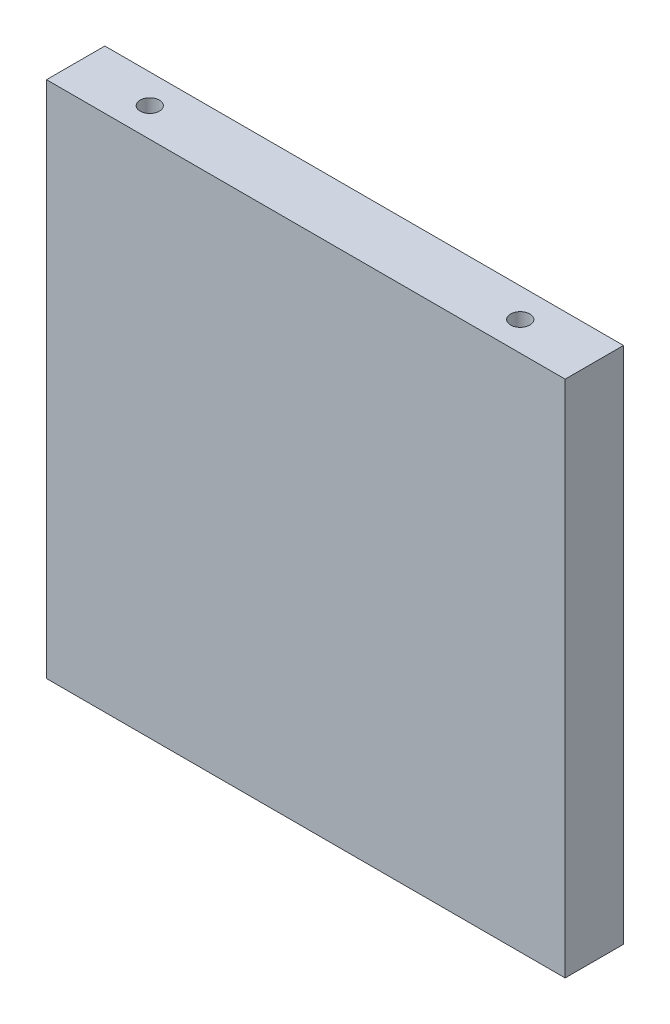
ISO-10303-21;
HEADER;
FILE_DESCRIPTION(('STEP AP214'),'2;1');
FILE_NAME('part.step','',(''),(''),'','','');
FILE_SCHEMA(('AUTOMOTIVE_DESIGN { 1 0 10303 214 1 1 1 1 }'));
ENDSEC;
DATA;
#1=APPLICATION_CONTEXT('core data for automotive mechanical design processes');
#2=APPLICATION_PROTOCOL_DEFINITION('international standard','automotive_design',2000,#1);
#3=PRODUCT_CONTEXT('',#1,'mechanical');
#4=PRODUCT('Part','Part','',(#3));
#5=PRODUCT_RELATED_PRODUCT_CATEGORY('part','',(#4));
#6=PRODUCT_DEFINITION_FORMATION('','',#4);
#7=PRODUCT_DEFINITION_CONTEXT('part definition',#1,'design');
#8=PRODUCT_DEFINITION('design','',#6,#7);
#9=PRODUCT_DEFINITION_SHAPE('','',#8);
#10=(LENGTH_UNIT() NAMED_UNIT(*) SI_UNIT(.MILLI.,.METRE.));
#11=(NAMED_UNIT(*) PLANE_ANGLE_UNIT() SI_UNIT($,.RADIAN.));
#12=(NAMED_UNIT(*) SI_UNIT($,.STERADIAN.) SOLID_ANGLE_UNIT());
#13=UNCERTAINTY_MEASURE_WITH_UNIT(LENGTH_MEASURE(1.E-05),#10,'distance_accuracy_value','');
#14=(GEOMETRIC_REPRESENTATION_CONTEXT(3) GLOBAL_UNCERTAINTY_ASSIGNED_CONTEXT((#13)) GLOBAL_UNIT_ASSIGNED_CONTEXT((#10,
#11,#12)) REPRESENTATION_CONTEXT('',''));
#15=CARTESIAN_POINT('',(0.,0.,0.));
#16=DIRECTION('',(0.,0.,1.));
#17=DIRECTION('',(1.,0.,0.));
#18=AXIS2_PLACEMENT_3D('',#15,#16,#17);
#19=CARTESIAN_POINT('',(0.,88.9,0.));
#20=DIRECTION('',(0.,0.,-1.));
#21=DIRECTION('',(-1.,0.,0.));
#22=AXIS2_PLACEMENT_3D('',#19,#20,#21);
#23=PLANE('',#22);
#24=DIRECTION('',(1.,0.,0.));
#25=VECTOR('',#24,1.);
#26=CARTESIAN_POINT('',(0.,0.,0.));
#27=LINE('',#26,#25);
#28=CARTESIAN_POINT('',(0.,0.,0.));
#29=VERTEX_POINT('',#28);
#30=CARTESIAN_POINT('',(88.9,0.,0.));
#31=VERTEX_POINT('',#30);
#32=EDGE_CURVE('E105',#29,#31,#27,.T.);
#33=ORIENTED_EDGE('',*,*,#32,.T.);
#34=DIRECTION('',(0.,-1.,0.));
#35=VECTOR('',#34,1.);
#36=CARTESIAN_POINT('',(88.9,88.9,0.));
#37=LINE('',#36,#35);
#38=CARTESIAN_POINT('',(88.9,88.9,0.));
#39=VERTEX_POINT('',#38);
#40=EDGE_CURVE('E11',#39,#31,#37,.T.);
#41=ORIENTED_EDGE('',*,*,#40,.F.);
#42=DIRECTION('',(1.,0.,0.));
#43=VECTOR('',#42,1.);
#44=CARTESIAN_POINT('',(0.,88.9,0.));
#45=LINE('',#44,#43);
#46=CARTESIAN_POINT('',(0.,88.9,0.));
#47=VERTEX_POINT('',#46);
#48=EDGE_CURVE('E85',#47,#39,#45,.T.);
#49=ORIENTED_EDGE('',*,*,#48,.F.);
#50=DIRECTION('',(0.,-1.,0.));
#51=VECTOR('',#50,1.);
#52=CARTESIAN_POINT('',(0.,88.9,0.));
#53=LINE('',#52,#51);
#54=EDGE_CURVE('E51',#47,#29,#53,.T.);
#55=ORIENTED_EDGE('',*,*,#54,.T.);
#56=EDGE_LOOP('',(#33,#41,#49,#55));
#57=FACE_BOUND('',#56,.T.);
#58=ADVANCED_FACE('F35',(#57),#23,.F.);
#59=CARTESIAN_POINT('',(88.9,88.9,0.));
#60=DIRECTION('',(-1.,0.,0.));
#61=DIRECTION('',(0.,0.,1.));
#62=AXIS2_PLACEMENT_3D('',#59,#60,#61);
#63=PLANE('',#62);
#64=DIRECTION('',(0.,0.,-1.));
#65=VECTOR('',#64,1.);
#66=CARTESIAN_POINT('',(88.9,0.,0.));
#67=LINE('',#66,#65);
#68=CARTESIAN_POINT('',(88.9,0.,-10.));
#69=VERTEX_POINT('',#68);
#70=EDGE_CURVE('E90',#31,#69,#67,.T.);
#71=ORIENTED_EDGE('',*,*,#70,.T.);
#72=DIRECTION('',(0.,-1.,0.));
#73=VECTOR('',#72,1.);
#74=CARTESIAN_POINT('',(88.9,88.9,-10.));
#75=LINE('',#74,#73);
#76=CARTESIAN_POINT('',(88.9,88.9,-10.));
#77=VERTEX_POINT('',#76);
#78=EDGE_CURVE('E43',#77,#69,#75,.T.);
#79=ORIENTED_EDGE('',*,*,#78,.F.);
#80=DIRECTION('',(0.,0.,-1.));
#81=VECTOR('',#80,1.);
#82=CARTESIAN_POINT('',(88.9,88.9,0.));
#83=LINE('',#82,#81);
#84=EDGE_CURVE('E76',#39,#77,#83,.T.);
#85=ORIENTED_EDGE('',*,*,#84,.F.);
#86=ORIENTED_EDGE('',*,*,#40,.T.);
#87=EDGE_LOOP('',(#71,#79,#85,#86));
#88=FACE_BOUND('',#87,.T.);
#89=ADVANCED_FACE('F89',(#88),#63,.F.);
#90=CARTESIAN_POINT('',(0.,88.9,-10.));
#91=DIRECTION('',(0.,0.,-1.));
#92=DIRECTION('',(-1.,0.,0.));
#93=AXIS2_PLACEMENT_3D('',#90,#91,#92);
#94=PLANE('',#93);
#95=DIRECTION('',(1.,0.,0.));
#96=VECTOR('',#95,1.);
#97=CARTESIAN_POINT('',(0.,0.,-10.));
#98=LINE('',#97,#96);
#99=CARTESIAN_POINT('',(0.,0.,-10.));
#100=VERTEX_POINT('',#99);
#101=EDGE_CURVE('E108',#100,#69,#98,.T.);
#102=ORIENTED_EDGE('',*,*,#101,.F.);
#103=DIRECTION('',(0.,-1.,0.));
#104=VECTOR('',#103,1.);
#105=CARTESIAN_POINT('',(0.,88.9,-10.));
#106=LINE('',#105,#104);
#107=CARTESIAN_POINT('',(0.,88.9,-10.));
#108=VERTEX_POINT('',#107);
#109=EDGE_CURVE('E65',#108,#100,#106,.T.);
#110=ORIENTED_EDGE('',*,*,#109,.F.);
#111=DIRECTION('',(1.,0.,0.));
#112=VECTOR('',#111,1.);
#113=CARTESIAN_POINT('',(0.,88.9,-10.));
#114=LINE('',#113,#112);
#115=EDGE_CURVE('E84',#108,#77,#114,.T.);
#116=ORIENTED_EDGE('',*,*,#115,.T.);
#117=ORIENTED_EDGE('',*,*,#78,.T.);
#118=EDGE_LOOP('',(#102,#110,#116,#117));
#119=FACE_BOUND('',#118,.T.);
#120=ADVANCED_FACE('F93',(#119),#94,.T.);
#121=CARTESIAN_POINT('',(12.7,88.9,-5.));
#122=DIRECTION('',(0.,-1.,0.));
#123=DIRECTION('',(0.,0.,-1.));
#124=AXIS2_PLACEMENT_3D('',#121,#122,#123);
#125=CYLINDRICAL_SURFACE('',#124,1.65);
#126=CARTESIAN_POINT('',(12.7,88.9,-5.));
#127=DIRECTION('',(0.,1.,0.));
#128=DIRECTION('',(0.,0.,1.));
#129=AXIS2_PLACEMENT_3D('',#126,#127,#128);
#130=CIRCLE('',#129,1.65);
#131=CARTESIAN_POINT('',(12.7,88.9,-3.35));
#132=VERTEX_POINT('',#131);
#133=EDGE_CURVE('E96',#132,#132,#130,.T.);
#134=ORIENTED_EDGE('',*,*,#133,.T.);
#135=EDGE_LOOP('',(#134));
#136=FACE_BOUND('',#135,.T.);
#137=CARTESIAN_POINT('',(12.7,0.,-5.));
#138=DIRECTION('',(0.,1.,0.));
#139=DIRECTION('',(0.,0.,1.));
#140=AXIS2_PLACEMENT_3D('',#137,#138,#139);
#141=CIRCLE('',#140,1.65);
#142=CARTESIAN_POINT('',(12.7,0.,-3.35));
#143=VERTEX_POINT('',#142);
#144=EDGE_CURVE('E113',#143,#143,#141,.T.);
#145=ORIENTED_EDGE('',*,*,#144,.F.);
#146=EDGE_LOOP('',(#145));
#147=FACE_BOUND('',#146,.T.);
#148=ADVANCED_FACE('F134',(#136,#147),#125,.F.);
#149=CARTESIAN_POINT('',(0.,88.9,0.));
#150=DIRECTION('',(-1.,0.,0.));
#151=DIRECTION('',(0.,0.,1.));
#152=AXIS2_PLACEMENT_3D('',#149,#150,#151);
#153=PLANE('',#152);
#154=DIRECTION('',(0.,0.,-1.));
#155=VECTOR('',#154,1.);
#156=CARTESIAN_POINT('',(0.,0.,0.));
#157=LINE('',#156,#155);
#158=EDGE_CURVE('E110',#29,#100,#157,.T.);
#159=ORIENTED_EDGE('',*,*,#158,.F.);
#160=ORIENTED_EDGE('',*,*,#54,.F.);
#161=DIRECTION('',(0.,0.,-1.));
#162=VECTOR('',#161,1.);
#163=CARTESIAN_POINT('',(0.,88.9,0.));
#164=LINE('',#163,#162);
#165=EDGE_CURVE('E94',#47,#108,#164,.T.);
#166=ORIENTED_EDGE('',*,*,#165,.T.);
#167=ORIENTED_EDGE('',*,*,#109,.T.);
#168=EDGE_LOOP('',(#159,#160,#166,#167));
#169=FACE_BOUND('',#168,.T.);
#170=ADVANCED_FACE('F126',(#169),#153,.T.);
#171=CARTESIAN_POINT('',(76.2,88.9,-5.00000000000001));
#172=DIRECTION('',(0.,-1.,0.));
#173=DIRECTION('',(0.,0.,-1.));
#174=AXIS2_PLACEMENT_3D('',#171,#172,#173);
#175=CYLINDRICAL_SURFACE('',#174,1.65);
#176=CARTESIAN_POINT('',(76.2,88.9,-5.00000000000001));
#177=DIRECTION('',(0.,1.,0.));
#178=DIRECTION('',(0.,0.,1.));
#179=AXIS2_PLACEMENT_3D('',#176,#177,#178);
#180=CIRCLE('',#179,1.65);
#181=CARTESIAN_POINT('',(76.2,88.9,-3.35000000000001));
#182=VERTEX_POINT('',#181);
#183=EDGE_CURVE('E102',#182,#182,#180,.T.);
#184=ORIENTED_EDGE('',*,*,#183,.T.);
#185=EDGE_LOOP('',(#184));
#186=FACE_BOUND('',#185,.T.);
#187=CARTESIAN_POINT('',(76.2,0.,-5.00000000000001));
#188=DIRECTION('',(0.,1.,0.));
#189=DIRECTION('',(0.,0.,1.));
#190=AXIS2_PLACEMENT_3D('',#187,#188,#189);
#191=CIRCLE('',#190,1.65);
#192=CARTESIAN_POINT('',(76.2,0.,-3.35000000000001));
#193=VERTEX_POINT('',#192);
#194=EDGE_CURVE('E116',#193,#193,#191,.T.);
#195=ORIENTED_EDGE('',*,*,#194,.F.);
#196=EDGE_LOOP('',(#195));
#197=FACE_BOUND('',#196,.T.);
#198=ADVANCED_FACE('F124',(#186,#197),#175,.F.);
#199=CARTESIAN_POINT('',(0.,88.9,0.));
#200=DIRECTION('',(0.,1.,0.));
#201=DIRECTION('',(0.,0.,1.));
#202=AXIS2_PLACEMENT_3D('',#199,#200,#201);
#203=PLANE('',#202);
#204=ORIENTED_EDGE('',*,*,#48,.T.);
#205=ORIENTED_EDGE('',*,*,#84,.T.);
#206=ORIENTED_EDGE('',*,*,#115,.F.);
#207=ORIENTED_EDGE('',*,*,#165,.F.);
#208=EDGE_LOOP('',(#204,#205,#206,#207));
#209=FACE_BOUND('',#208,.T.);
#210=ORIENTED_EDGE('',*,*,#133,.F.);
#211=EDGE_LOOP('',(#210));
#212=FACE_BOUND('',#211,.T.);
#213=ORIENTED_EDGE('',*,*,#183,.F.);
#214=EDGE_LOOP('',(#213));
#215=FACE_BOUND('',#214,.T.);
#216=ADVANCED_FACE('F80',(#209,#212,#215),#203,.T.);
#217=CARTESIAN_POINT('',(0.,0.,0.));
#218=DIRECTION('',(0.,1.,0.));
#219=DIRECTION('',(0.,0.,1.));
#220=AXIS2_PLACEMENT_3D('',#217,#218,#219);
#221=PLANE('',#220);
#222=ORIENTED_EDGE('',*,*,#32,.F.);
#223=ORIENTED_EDGE('',*,*,#158,.T.);
#224=ORIENTED_EDGE('',*,*,#101,.T.);
#225=ORIENTED_EDGE('',*,*,#70,.F.);
#226=EDGE_LOOP('',(#222,#223,#224,#225));
#227=FACE_BOUND('',#226,.T.);
#228=ORIENTED_EDGE('',*,*,#144,.T.);
#229=EDGE_LOOP('',(#228));
#230=FACE_BOUND('',#229,.T.);
#231=ORIENTED_EDGE('',*,*,#194,.T.);
#232=EDGE_LOOP('',(#231));
#233=FACE_BOUND('',#232,.T.);
#234=ADVANCED_FACE('F122',(#227,#230,#233),#221,.F.);
#235=CLOSED_SHELL('',(#58,#89,#120,#148,#170,#198,#216,#234));
#236=MANIFOLD_SOLID_BREP('B2',#235);
#237=ADVANCED_BREP_SHAPE_REPRESENTATION('',(#18,#236),#14);
#238=SHAPE_DEFINITION_REPRESENTATION(#9,#237);
ENDSEC;
END-ISO-10303-21;
